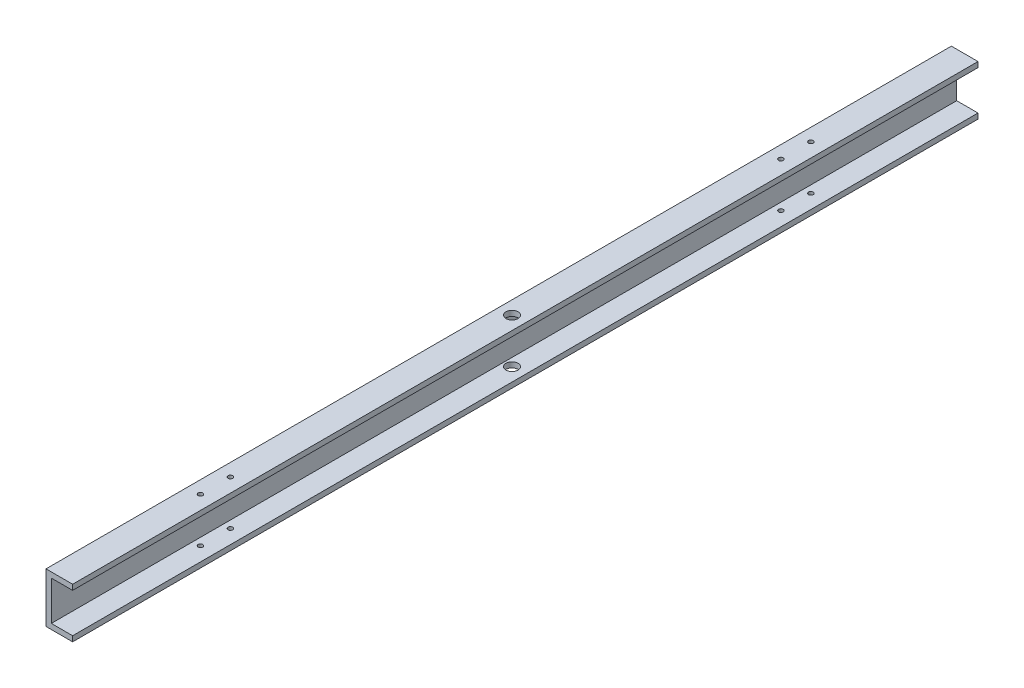
ISO-10303-21;
HEADER;
FILE_DESCRIPTION(('STEP AP214'),'2;1');
FILE_NAME('part.step','',(''),(''),'','','');
FILE_SCHEMA(('AUTOMOTIVE_DESIGN { 1 0 10303 214 1 1 1 1 }'));
ENDSEC;
DATA;
#1=APPLICATION_CONTEXT('core data for automotive mechanical design processes');
#2=APPLICATION_PROTOCOL_DEFINITION('international standard','automotive_design',2000,#1);
#3=PRODUCT_CONTEXT('',#1,'mechanical');
#4=PRODUCT('Part','Part','',(#3));
#5=PRODUCT_RELATED_PRODUCT_CATEGORY('part','',(#4));
#6=PRODUCT_DEFINITION_FORMATION('','',#4);
#7=PRODUCT_DEFINITION_CONTEXT('part definition',#1,'design');
#8=PRODUCT_DEFINITION('design','',#6,#7);
#9=PRODUCT_DEFINITION_SHAPE('','',#8);
#10=(LENGTH_UNIT() NAMED_UNIT(*) SI_UNIT(.MILLI.,.METRE.));
#11=(NAMED_UNIT(*) PLANE_ANGLE_UNIT() SI_UNIT($,.RADIAN.));
#12=(NAMED_UNIT(*) SI_UNIT($,.STERADIAN.) SOLID_ANGLE_UNIT());
#13=UNCERTAINTY_MEASURE_WITH_UNIT(LENGTH_MEASURE(1.E-05),#10,'distance_accuracy_value','');
#14=(GEOMETRIC_REPRESENTATION_CONTEXT(3) GLOBAL_UNCERTAINTY_ASSIGNED_CONTEXT((#13)) GLOBAL_UNIT_ASSIGNED_CONTEXT((#10,
#11,#12)) REPRESENTATION_CONTEXT('',''));
#15=CARTESIAN_POINT('',(0.,0.,0.));
#16=DIRECTION('',(0.,0.,1.));
#17=DIRECTION('',(1.,0.,0.));
#18=AXIS2_PLACEMENT_3D('',#15,#16,#17);
#19=CARTESIAN_POINT('',(-400.,550.,764.999999999999));
#20=DIRECTION('',(0.,1.,0.));
#21=DIRECTION('',(0.,0.,1.));
#22=AXIS2_PLACEMENT_3D('',#19,#20,#21);
#23=PLANE('',#22);
#24=CARTESIAN_POINT('',(-421.,550.,467.));
#25=DIRECTION('',(0.,1.,0.));
#26=DIRECTION('',(0.,0.,1.));
#27=AXIS2_PLACEMENT_3D('',#24,#25,#26);
#28=CIRCLE('',#27,3.50000000000002);
#29=CARTESIAN_POINT('',(-421.,550.,470.5));
#30=VERTEX_POINT('',#29);
#31=EDGE_CURVE('E242',#30,#30,#28,.T.);
#32=ORIENTED_EDGE('',*,*,#31,.T.);
#33=EDGE_LOOP('',(#32));
#34=FACE_BOUND('',#33,.T.);
#35=CARTESIAN_POINT('',(-421.,550.,422.));
#36=DIRECTION('',(0.,1.,0.));
#37=DIRECTION('',(0.,0.,1.));
#38=AXIS2_PLACEMENT_3D('',#35,#36,#37);
#39=CIRCLE('',#38,3.50000000000002);
#40=CARTESIAN_POINT('',(-421.,550.,425.5));
#41=VERTEX_POINT('',#40);
#42=EDGE_CURVE('E269',#41,#41,#39,.T.);
#43=ORIENTED_EDGE('',*,*,#42,.T.);
#44=EDGE_LOOP('',(#43));
#45=FACE_BOUND('',#44,.T.);
#46=CARTESIAN_POINT('',(-420.,550.,0.));
#47=DIRECTION('',(0.,1.,0.));
#48=DIRECTION('',(0.,0.,1.));
#49=AXIS2_PLACEMENT_3D('',#46,#47,#48);
#50=CIRCLE('',#49,8.99999999999998);
#51=CARTESIAN_POINT('',(-420.,550.,9.00000000000007));
#52=VERTEX_POINT('',#51);
#53=EDGE_CURVE('E262',#52,#52,#50,.T.);
#54=ORIENTED_EDGE('',*,*,#53,.T.);
#55=EDGE_LOOP('',(#54));
#56=FACE_BOUND('',#55,.T.);
#57=CARTESIAN_POINT('',(-421.,550.,-450.));
#58=DIRECTION('',(0.,1.,0.));
#59=DIRECTION('',(0.,0.,1.));
#60=AXIS2_PLACEMENT_3D('',#57,#58,#59);
#61=CIRCLE('',#60,3.50000000000002);
#62=CARTESIAN_POINT('',(-421.,550.,-446.5));
#63=VERTEX_POINT('',#62);
#64=EDGE_CURVE('E254',#63,#63,#61,.T.);
#65=ORIENTED_EDGE('',*,*,#64,.T.);
#66=EDGE_LOOP('',(#65));
#67=FACE_BOUND('',#66,.T.);
#68=CARTESIAN_POINT('',(-421.,550.,-405.));
#69=DIRECTION('',(0.,1.,0.));
#70=DIRECTION('',(0.,0.,1.));
#71=AXIS2_PLACEMENT_3D('',#68,#69,#70);
#72=CIRCLE('',#71,3.50000000000002);
#73=CARTESIAN_POINT('',(-421.,550.,-401.5));
#74=VERTEX_POINT('',#73);
#75=EDGE_CURVE('E247',#74,#74,#72,.T.);
#76=ORIENTED_EDGE('',*,*,#75,.T.);
#77=EDGE_LOOP('',(#76));
#78=FACE_BOUND('',#77,.T.);
#79=DIRECTION('',(1.,0.,0.));
#80=VECTOR('',#79,1.);
#81=CARTESIAN_POINT('',(-400.,550.,680.));
#82=LINE('',#81,#80);
#83=CARTESIAN_POINT('',(-440.,550.,680.));
#84=VERTEX_POINT('',#83);
#85=CARTESIAN_POINT('',(-400.,550.,680.));
#86=VERTEX_POINT('',#85);
#87=EDGE_CURVE('E148',#84,#86,#82,.T.);
#88=ORIENTED_EDGE('',*,*,#87,.F.);
#89=DIRECTION('',(0.,0.,-1.));
#90=VECTOR('',#89,1.);
#91=CARTESIAN_POINT('',(-440.,550.,764.999999999999));
#92=LINE('',#91,#90);
#93=CARTESIAN_POINT('',(-440.,550.,-680.));
#94=VERTEX_POINT('',#93);
#95=EDGE_CURVE('E44',#84,#94,#92,.T.);
#96=ORIENTED_EDGE('',*,*,#95,.T.);
#97=DIRECTION('',(1.,0.,0.));
#98=VECTOR('',#97,1.);
#99=CARTESIAN_POINT('',(-400.,550.,-680.));
#100=LINE('',#99,#98);
#101=CARTESIAN_POINT('',(-400.,550.,-680.));
#102=VERTEX_POINT('',#101);
#103=EDGE_CURVE('E159',#94,#102,#100,.T.);
#104=ORIENTED_EDGE('',*,*,#103,.T.);
#105=DIRECTION('',(0.,0.,-1.));
#106=VECTOR('',#105,1.);
#107=CARTESIAN_POINT('',(-400.,550.,764.999999999999));
#108=LINE('',#107,#106);
#109=EDGE_CURVE('E96',#86,#102,#108,.T.);
#110=ORIENTED_EDGE('',*,*,#109,.F.);
#111=EDGE_LOOP('',(#88,#96,#104,#110));
#112=FACE_BOUND('',#111,.T.);
#113=ADVANCED_FACE('F40',(#34,#45,#56,#67,#78,#112),#23,.F.);
#114=CARTESIAN_POINT('',(-400.,558.,764.999999999999));
#115=DIRECTION('',(-1.,0.,0.));
#116=DIRECTION('',(0.,-1.,0.));
#117=AXIS2_PLACEMENT_3D('',#114,#115,#116);
#118=PLANE('',#117);
#119=DIRECTION('',(0.,1.,0.));
#120=VECTOR('',#119,1.);
#121=CARTESIAN_POINT('',(-400.,558.,680.));
#122=LINE('',#121,#120);
#123=CARTESIAN_POINT('',(-400.,558.,680.));
#124=VERTEX_POINT('',#123);
#125=EDGE_CURVE('E103',#86,#124,#122,.T.);
#126=ORIENTED_EDGE('',*,*,#125,.F.);
#127=ORIENTED_EDGE('',*,*,#109,.T.);
#128=DIRECTION('',(0.,1.,0.));
#129=VECTOR('',#128,1.);
#130=CARTESIAN_POINT('',(-400.,558.,-680.));
#131=LINE('',#130,#129);
#132=CARTESIAN_POINT('',(-400.,558.,-680.));
#133=VERTEX_POINT('',#132);
#134=EDGE_CURVE('E158',#102,#133,#131,.T.);
#135=ORIENTED_EDGE('',*,*,#134,.T.);
#136=DIRECTION('',(0.,0.,-1.));
#137=VECTOR('',#136,1.);
#138=CARTESIAN_POINT('',(-400.,558.,764.999999999999));
#139=LINE('',#138,#137);
#140=EDGE_CURVE('E160',#124,#133,#139,.T.);
#141=ORIENTED_EDGE('',*,*,#140,.F.);
#142=EDGE_LOOP('',(#126,#127,#135,#141));
#143=FACE_BOUND('',#142,.T.);
#144=ADVANCED_FACE('F299',(#143),#118,.F.);
#145=CARTESIAN_POINT('',(-432.,558.,764.999999999999));
#146=DIRECTION('',(0.,-1.,0.));
#147=DIRECTION('',(1.,0.,0.));
#148=AXIS2_PLACEMENT_3D('',#145,#146,#147);
#149=PLANE('',#148);
#150=CARTESIAN_POINT('',(-421.,558.,467.));
#151=DIRECTION('',(0.,-1.,0.));
#152=DIRECTION('',(1.,0.,0.));
#153=AXIS2_PLACEMENT_3D('',#150,#151,#152);
#154=CIRCLE('',#153,3.50000000000002);
#155=CARTESIAN_POINT('',(-417.5,558.,467.));
#156=VERTEX_POINT('',#155);
#157=EDGE_CURVE('E200',#156,#156,#154,.T.);
#158=ORIENTED_EDGE('',*,*,#157,.T.);
#159=EDGE_LOOP('',(#158));
#160=FACE_BOUND('',#159,.T.);
#161=CARTESIAN_POINT('',(-421.,558.,422.));
#162=DIRECTION('',(0.,-1.,0.));
#163=DIRECTION('',(1.,0.,0.));
#164=AXIS2_PLACEMENT_3D('',#161,#162,#163);
#165=CIRCLE('',#164,3.50000000000002);
#166=CARTESIAN_POINT('',(-417.5,558.,422.));
#167=VERTEX_POINT('',#166);
#168=EDGE_CURVE('E208',#167,#167,#165,.T.);
#169=ORIENTED_EDGE('',*,*,#168,.T.);
#170=EDGE_LOOP('',(#169));
#171=FACE_BOUND('',#170,.T.);
#172=CARTESIAN_POINT('',(-420.,558.,0.));
#173=DIRECTION('',(0.,-1.,0.));
#174=DIRECTION('',(1.,0.,0.));
#175=AXIS2_PLACEMENT_3D('',#172,#173,#174);
#176=CIRCLE('',#175,8.99999999999998);
#177=CARTESIAN_POINT('',(-411.,558.,0.));
#178=VERTEX_POINT('',#177);
#179=EDGE_CURVE('E218',#178,#178,#176,.T.);
#180=ORIENTED_EDGE('',*,*,#179,.T.);
#181=EDGE_LOOP('',(#180));
#182=FACE_BOUND('',#181,.T.);
#183=CARTESIAN_POINT('',(-421.,558.,-450.));
#184=DIRECTION('',(0.,-1.,0.));
#185=DIRECTION('',(1.,0.,0.));
#186=AXIS2_PLACEMENT_3D('',#183,#184,#185);
#187=CIRCLE('',#186,3.50000000000002);
#188=CARTESIAN_POINT('',(-417.5,558.,-450.));
#189=VERTEX_POINT('',#188);
#190=EDGE_CURVE('E226',#189,#189,#187,.T.);
#191=ORIENTED_EDGE('',*,*,#190,.T.);
#192=EDGE_LOOP('',(#191));
#193=FACE_BOUND('',#192,.T.);
#194=CARTESIAN_POINT('',(-421.,558.,-405.));
#195=DIRECTION('',(0.,-1.,0.));
#196=DIRECTION('',(1.,0.,0.));
#197=AXIS2_PLACEMENT_3D('',#194,#195,#196);
#198=CIRCLE('',#197,3.50000000000002);
#199=CARTESIAN_POINT('',(-417.5,558.,-405.));
#200=VERTEX_POINT('',#199);
#201=EDGE_CURVE('E234',#200,#200,#198,.T.);
#202=ORIENTED_EDGE('',*,*,#201,.T.);
#203=EDGE_LOOP('',(#202));
#204=FACE_BOUND('',#203,.T.);
#205=DIRECTION('',(-1.,0.,0.));
#206=VECTOR('',#205,1.);
#207=CARTESIAN_POINT('',(-432.,558.,680.));
#208=LINE('',#207,#206);
#209=CARTESIAN_POINT('',(-432.,558.,680.));
#210=VERTEX_POINT('',#209);
#211=EDGE_CURVE('E142',#124,#210,#208,.T.);
#212=ORIENTED_EDGE('',*,*,#211,.F.);
#213=ORIENTED_EDGE('',*,*,#140,.T.);
#214=DIRECTION('',(-1.,0.,0.));
#215=VECTOR('',#214,1.);
#216=CARTESIAN_POINT('',(-432.,558.,-680.));
#217=LINE('',#216,#215);
#218=CARTESIAN_POINT('',(-432.,558.,-680.));
#219=VERTEX_POINT('',#218);
#220=EDGE_CURVE('E163',#133,#219,#217,.T.);
#221=ORIENTED_EDGE('',*,*,#220,.T.);
#222=DIRECTION('',(0.,0.,-1.));
#223=VECTOR('',#222,1.);
#224=CARTESIAN_POINT('',(-432.,558.,764.999999999999));
#225=LINE('',#224,#223);
#226=EDGE_CURVE('E164',#210,#219,#225,.T.);
#227=ORIENTED_EDGE('',*,*,#226,.F.);
#228=EDGE_LOOP('',(#212,#213,#221,#227));
#229=FACE_BOUND('',#228,.T.);
#230=ADVANCED_FACE('F303',(#160,#171,#182,#193,#204,#229),#149,.F.);
#231=CARTESIAN_POINT('',(-432.,617.,764.999999999999));
#232=DIRECTION('',(-1.,0.,0.));
#233=DIRECTION('',(0.,0.,1.));
#234=AXIS2_PLACEMENT_3D('',#231,#232,#233);
#235=PLANE('',#234);
#236=DIRECTION('',(0.,1.,0.));
#237=VECTOR('',#236,1.);
#238=CARTESIAN_POINT('',(-432.,617.,680.));
#239=LINE('',#238,#237);
#240=CARTESIAN_POINT('',(-432.,617.,680.));
#241=VERTEX_POINT('',#240);
#242=EDGE_CURVE('E136',#210,#241,#239,.T.);
#243=ORIENTED_EDGE('',*,*,#242,.F.);
#244=ORIENTED_EDGE('',*,*,#226,.T.);
#245=DIRECTION('',(0.,1.,0.));
#246=VECTOR('',#245,1.);
#247=CARTESIAN_POINT('',(-432.,617.,-680.));
#248=LINE('',#247,#246);
#249=CARTESIAN_POINT('',(-432.,617.,-680.));
#250=VERTEX_POINT('',#249);
#251=EDGE_CURVE('E167',#219,#250,#248,.T.);
#252=ORIENTED_EDGE('',*,*,#251,.T.);
#253=DIRECTION('',(0.,0.,-1.));
#254=VECTOR('',#253,1.);
#255=CARTESIAN_POINT('',(-432.,617.,764.999999999999));
#256=LINE('',#255,#254);
#257=EDGE_CURVE('E168',#241,#250,#256,.T.);
#258=ORIENTED_EDGE('',*,*,#257,.F.);
#259=EDGE_LOOP('',(#243,#244,#252,#258));
#260=FACE_BOUND('',#259,.T.);
#261=ADVANCED_FACE('F308',(#260),#235,.F.);
#262=CARTESIAN_POINT('',(-400.,617.,764.999999999999));
#263=DIRECTION('',(0.,1.,0.));
#264=DIRECTION('',(0.,0.,1.));
#265=AXIS2_PLACEMENT_3D('',#262,#263,#264);
#266=PLANE('',#265);
#267=CARTESIAN_POINT('',(-421.,617.,467.));
#268=DIRECTION('',(0.,1.,0.));
#269=DIRECTION('',(0.,0.,1.));
#270=AXIS2_PLACEMENT_3D('',#267,#268,#269);
#271=CIRCLE('',#270,3.50000000000002);
#272=CARTESIAN_POINT('',(-421.,617.,470.5));
#273=VERTEX_POINT('',#272);
#274=EDGE_CURVE('E204',#273,#273,#271,.T.);
#275=ORIENTED_EDGE('',*,*,#274,.T.);
#276=EDGE_LOOP('',(#275));
#277=FACE_BOUND('',#276,.T.);
#278=CARTESIAN_POINT('',(-421.,617.,422.));
#279=DIRECTION('',(0.,1.,0.));
#280=DIRECTION('',(0.,0.,1.));
#281=AXIS2_PLACEMENT_3D('',#278,#279,#280);
#282=CIRCLE('',#281,3.50000000000002);
#283=CARTESIAN_POINT('',(-421.,617.,425.5));
#284=VERTEX_POINT('',#283);
#285=EDGE_CURVE('E214',#284,#284,#282,.T.);
#286=ORIENTED_EDGE('',*,*,#285,.T.);
#287=EDGE_LOOP('',(#286));
#288=FACE_BOUND('',#287,.T.);
#289=CARTESIAN_POINT('',(-420.,617.,0.));
#290=DIRECTION('',(0.,1.,0.));
#291=DIRECTION('',(0.,0.,1.));
#292=AXIS2_PLACEMENT_3D('',#289,#290,#291);
#293=CIRCLE('',#292,8.99999999999998);
#294=CARTESIAN_POINT('',(-420.,617.,9.00000000000007));
#295=VERTEX_POINT('',#294);
#296=EDGE_CURVE('E222',#295,#295,#293,.T.);
#297=ORIENTED_EDGE('',*,*,#296,.T.);
#298=EDGE_LOOP('',(#297));
#299=FACE_BOUND('',#298,.T.);
#300=CARTESIAN_POINT('',(-421.,617.,-450.));
#301=DIRECTION('',(0.,1.,0.));
#302=DIRECTION('',(0.,0.,1.));
#303=AXIS2_PLACEMENT_3D('',#300,#301,#302);
#304=CIRCLE('',#303,3.50000000000002);
#305=CARTESIAN_POINT('',(-421.,617.,-446.5));
#306=VERTEX_POINT('',#305);
#307=EDGE_CURVE('E230',#306,#306,#304,.T.);
#308=ORIENTED_EDGE('',*,*,#307,.T.);
#309=EDGE_LOOP('',(#308));
#310=FACE_BOUND('',#309,.T.);
#311=CARTESIAN_POINT('',(-421.,617.,-405.));
#312=DIRECTION('',(0.,1.,0.));
#313=DIRECTION('',(0.,0.,1.));
#314=AXIS2_PLACEMENT_3D('',#311,#312,#313);
#315=CIRCLE('',#314,3.50000000000002);
#316=CARTESIAN_POINT('',(-421.,617.,-401.5));
#317=VERTEX_POINT('',#316);
#318=EDGE_CURVE('E238',#317,#317,#315,.T.);
#319=ORIENTED_EDGE('',*,*,#318,.T.);
#320=EDGE_LOOP('',(#319));
#321=FACE_BOUND('',#320,.T.);
#322=DIRECTION('',(1.,0.,0.));
#323=VECTOR('',#322,1.);
#324=CARTESIAN_POINT('',(-400.,617.,680.));
#325=LINE('',#324,#323);
#326=CARTESIAN_POINT('',(-400.,617.,680.));
#327=VERTEX_POINT('',#326);
#328=EDGE_CURVE('E130',#241,#327,#325,.T.);
#329=ORIENTED_EDGE('',*,*,#328,.F.);
#330=ORIENTED_EDGE('',*,*,#257,.T.);
#331=DIRECTION('',(1.,0.,0.));
#332=VECTOR('',#331,1.);
#333=CARTESIAN_POINT('',(-400.,617.,-680.));
#334=LINE('',#333,#332);
#335=CARTESIAN_POINT('',(-400.,617.,-680.));
#336=VERTEX_POINT('',#335);
#337=EDGE_CURVE('E171',#250,#336,#334,.T.);
#338=ORIENTED_EDGE('',*,*,#337,.T.);
#339=DIRECTION('',(0.,0.,-1.));
#340=VECTOR('',#339,1.);
#341=CARTESIAN_POINT('',(-400.,617.,764.999999999999));
#342=LINE('',#341,#340);
#343=EDGE_CURVE('E172',#327,#336,#342,.T.);
#344=ORIENTED_EDGE('',*,*,#343,.F.);
#345=EDGE_LOOP('',(#329,#330,#338,#344));
#346=FACE_BOUND('',#345,.T.);
#347=ADVANCED_FACE('F311',(#277,#288,#299,#310,#321,#346),#266,.F.);
#348=CARTESIAN_POINT('',(-400.,625.,764.999999999999));
#349=DIRECTION('',(-1.,0.,0.));
#350=DIRECTION('',(0.,0.,1.));
#351=AXIS2_PLACEMENT_3D('',#348,#349,#350);
#352=PLANE('',#351);
#353=DIRECTION('',(0.,1.,0.));
#354=VECTOR('',#353,1.);
#355=CARTESIAN_POINT('',(-400.,625.,680.));
#356=LINE('',#355,#354);
#357=CARTESIAN_POINT('',(-400.,625.,680.));
#358=VERTEX_POINT('',#357);
#359=EDGE_CURVE('E50',#327,#358,#356,.T.);
#360=ORIENTED_EDGE('',*,*,#359,.F.);
#361=ORIENTED_EDGE('',*,*,#343,.T.);
#362=DIRECTION('',(0.,1.,0.));
#363=VECTOR('',#362,1.);
#364=CARTESIAN_POINT('',(-400.,625.,-680.));
#365=LINE('',#364,#363);
#366=CARTESIAN_POINT('',(-400.,625.,-680.));
#367=VERTEX_POINT('',#366);
#368=EDGE_CURVE('E123',#336,#367,#365,.T.);
#369=ORIENTED_EDGE('',*,*,#368,.T.);
#370=DIRECTION('',(0.,0.,-1.));
#371=VECTOR('',#370,1.);
#372=CARTESIAN_POINT('',(-400.,625.,764.999999999999));
#373=LINE('',#372,#371);
#374=EDGE_CURVE('E114',#358,#367,#373,.T.);
#375=ORIENTED_EDGE('',*,*,#374,.F.);
#376=EDGE_LOOP('',(#360,#361,#369,#375));
#377=FACE_BOUND('',#376,.T.);
#378=ADVANCED_FACE('F120',(#377),#352,.F.);
#379=CARTESIAN_POINT('',(-440.,625.,764.999999999999));
#380=DIRECTION('',(0.,-1.,0.));
#381=DIRECTION('',(0.,0.,-1.));
#382=AXIS2_PLACEMENT_3D('',#379,#380,#381);
#383=PLANE('',#382);
#384=CARTESIAN_POINT('',(-421.,625.,467.));
#385=DIRECTION('',(0.,1.,0.));
#386=DIRECTION('',(0.,0.,1.));
#387=AXIS2_PLACEMENT_3D('',#384,#385,#386);
#388=CIRCLE('',#387,3.50000000000002);
#389=CARTESIAN_POINT('',(-421.,625.,470.5));
#390=VERTEX_POINT('',#389);
#391=EDGE_CURVE('E272',#390,#390,#388,.T.);
#392=ORIENTED_EDGE('',*,*,#391,.F.);
#393=EDGE_LOOP('',(#392));
#394=FACE_BOUND('',#393,.T.);
#395=CARTESIAN_POINT('',(-421.,625.,422.));
#396=DIRECTION('',(0.,1.,0.));
#397=DIRECTION('',(0.,0.,1.));
#398=AXIS2_PLACEMENT_3D('',#395,#396,#397);
#399=CIRCLE('',#398,3.50000000000002);
#400=CARTESIAN_POINT('',(-421.,625.,425.5));
#401=VERTEX_POINT('',#400);
#402=EDGE_CURVE('E265',#401,#401,#399,.T.);
#403=ORIENTED_EDGE('',*,*,#402,.F.);
#404=EDGE_LOOP('',(#403));
#405=FACE_BOUND('',#404,.T.);
#406=CARTESIAN_POINT('',(-420.,625.,0.));
#407=DIRECTION('',(0.,1.,0.));
#408=DIRECTION('',(0.,0.,1.));
#409=AXIS2_PLACEMENT_3D('',#406,#407,#408);
#410=CIRCLE('',#409,8.99999999999998);
#411=CARTESIAN_POINT('',(-420.,625.,9.00000000000007));
#412=VERTEX_POINT('',#411);
#413=EDGE_CURVE('E258',#412,#412,#410,.T.);
#414=ORIENTED_EDGE('',*,*,#413,.F.);
#415=EDGE_LOOP('',(#414));
#416=FACE_BOUND('',#415,.T.);
#417=CARTESIAN_POINT('',(-421.,625.,-450.));
#418=DIRECTION('',(0.,1.,0.));
#419=DIRECTION('',(0.,0.,1.));
#420=AXIS2_PLACEMENT_3D('',#417,#418,#419);
#421=CIRCLE('',#420,3.50000000000002);
#422=CARTESIAN_POINT('',(-421.,625.,-446.5));
#423=VERTEX_POINT('',#422);
#424=EDGE_CURVE('E251',#423,#423,#421,.T.);
#425=ORIENTED_EDGE('',*,*,#424,.F.);
#426=EDGE_LOOP('',(#425));
#427=FACE_BOUND('',#426,.T.);
#428=CARTESIAN_POINT('',(-421.,625.,-405.));
#429=DIRECTION('',(0.,1.,0.));
#430=DIRECTION('',(0.,0.,1.));
#431=AXIS2_PLACEMENT_3D('',#428,#429,#430);
#432=CIRCLE('',#431,3.50000000000002);
#433=CARTESIAN_POINT('',(-421.,625.,-401.5));
#434=VERTEX_POINT('',#433);
#435=EDGE_CURVE('E243',#434,#434,#432,.T.);
#436=ORIENTED_EDGE('',*,*,#435,.F.);
#437=EDGE_LOOP('',(#436));
#438=FACE_BOUND('',#437,.T.);
#439=DIRECTION('',(-1.,0.,0.));
#440=VECTOR('',#439,1.);
#441=CARTESIAN_POINT('',(-440.,625.,680.));
#442=LINE('',#441,#440);
#443=CARTESIAN_POINT('',(-440.,625.,680.));
#444=VERTEX_POINT('',#443);
#445=EDGE_CURVE('E11',#358,#444,#442,.T.);
#446=ORIENTED_EDGE('',*,*,#445,.F.);
#447=ORIENTED_EDGE('',*,*,#374,.T.);
#448=DIRECTION('',(-1.,0.,0.));
#449=VECTOR('',#448,1.);
#450=CARTESIAN_POINT('',(-440.,625.,-680.));
#451=LINE('',#450,#449);
#452=CARTESIAN_POINT('',(-440.,625.,-680.));
#453=VERTEX_POINT('',#452);
#454=EDGE_CURVE('E126',#367,#453,#451,.T.);
#455=ORIENTED_EDGE('',*,*,#454,.T.);
#456=DIRECTION('',(0.,0.,-1.));
#457=VECTOR('',#456,1.);
#458=CARTESIAN_POINT('',(-440.,625.,764.999999999999));
#459=LINE('',#458,#457);
#460=EDGE_CURVE('E63',#444,#453,#459,.T.);
#461=ORIENTED_EDGE('',*,*,#460,.F.);
#462=EDGE_LOOP('',(#446,#447,#455,#461));
#463=FACE_BOUND('',#462,.T.);
#464=ADVANCED_FACE('F113',(#394,#405,#416,#427,#438,#463),#383,.F.);
#465=CARTESIAN_POINT('',(-440.,550.,764.999999999999));
#466=DIRECTION('',(1.,0.,0.));
#467=DIRECTION('',(0.,0.,-1.));
#468=AXIS2_PLACEMENT_3D('',#465,#466,#467);
#469=PLANE('',#468);
#470=DIRECTION('',(0.,-1.,0.));
#471=VECTOR('',#470,1.);
#472=CARTESIAN_POINT('',(-440.,550.,680.));
#473=LINE('',#472,#471);
#474=EDGE_CURVE('E152',#444,#84,#473,.T.);
#475=ORIENTED_EDGE('',*,*,#474,.F.);
#476=ORIENTED_EDGE('',*,*,#460,.T.);
#477=DIRECTION('',(0.,-1.,0.));
#478=VECTOR('',#477,1.);
#479=CARTESIAN_POINT('',(-440.,550.,-680.));
#480=LINE('',#479,#478);
#481=EDGE_CURVE('E155',#453,#94,#480,.T.);
#482=ORIENTED_EDGE('',*,*,#481,.T.);
#483=ORIENTED_EDGE('',*,*,#95,.F.);
#484=EDGE_LOOP('',(#475,#476,#482,#483));
#485=FACE_BOUND('',#484,.T.);
#486=ADVANCED_FACE('F320',(#485),#469,.F.);
#487=CARTESIAN_POINT('',(0.,0.,-680.));
#488=DIRECTION('',(0.,0.,-1.));
#489=DIRECTION('',(-1.,0.,0.));
#490=AXIS2_PLACEMENT_3D('',#487,#488,#489);
#491=PLANE('',#490);
#492=ORIENTED_EDGE('',*,*,#103,.F.);
#493=ORIENTED_EDGE('',*,*,#481,.F.);
#494=ORIENTED_EDGE('',*,*,#454,.F.);
#495=ORIENTED_EDGE('',*,*,#368,.F.);
#496=ORIENTED_EDGE('',*,*,#337,.F.);
#497=ORIENTED_EDGE('',*,*,#251,.F.);
#498=ORIENTED_EDGE('',*,*,#220,.F.);
#499=ORIENTED_EDGE('',*,*,#134,.F.);
#500=EDGE_LOOP('',(#492,#493,#494,#495,#496,#497,#498,#499));
#501=FACE_BOUND('',#500,.T.);
#502=ADVANCED_FACE('F324',(#501),#491,.T.);
#503=CARTESIAN_POINT('',(400.,950.,680.));
#504=DIRECTION('',(0.,0.,1.));
#505=DIRECTION('',(1.,0.,0.));
#506=AXIS2_PLACEMENT_3D('',#503,#504,#505);
#507=PLANE('',#506);
#508=ORIENTED_EDGE('',*,*,#474,.T.);
#509=ORIENTED_EDGE('',*,*,#87,.T.);
#510=ORIENTED_EDGE('',*,*,#125,.T.);
#511=ORIENTED_EDGE('',*,*,#211,.T.);
#512=ORIENTED_EDGE('',*,*,#242,.T.);
#513=ORIENTED_EDGE('',*,*,#328,.T.);
#514=ORIENTED_EDGE('',*,*,#359,.T.);
#515=ORIENTED_EDGE('',*,*,#445,.T.);
#516=EDGE_LOOP('',(#508,#509,#510,#511,#512,#513,#514,#515));
#517=FACE_BOUND('',#516,.T.);
#518=ADVANCED_FACE('F42',(#517),#507,.T.);
#519=CARTESIAN_POINT('',(-421.,550.,-405.));
#520=DIRECTION('',(0.,1.,0.));
#521=DIRECTION('',(0.,0.,1.));
#522=AXIS2_PLACEMENT_3D('',#519,#520,#521);
#523=CYLINDRICAL_SURFACE('',#522,3.50000000000002);
#524=ORIENTED_EDGE('',*,*,#435,.T.);
#525=EDGE_LOOP('',(#524));
#526=FACE_BOUND('',#525,.T.);
#527=ORIENTED_EDGE('',*,*,#318,.F.);
#528=EDGE_LOOP('',(#527));
#529=FACE_BOUND('',#528,.T.);
#530=ADVANCED_FACE('F332',(#526,#529),#523,.F.);
#531=CARTESIAN_POINT('',(-421.,550.,-450.));
#532=DIRECTION('',(0.,1.,0.));
#533=DIRECTION('',(0.,0.,1.));
#534=AXIS2_PLACEMENT_3D('',#531,#532,#533);
#535=CYLINDRICAL_SURFACE('',#534,3.50000000000002);
#536=ORIENTED_EDGE('',*,*,#424,.T.);
#537=EDGE_LOOP('',(#536));
#538=FACE_BOUND('',#537,.T.);
#539=ORIENTED_EDGE('',*,*,#307,.F.);
#540=EDGE_LOOP('',(#539));
#541=FACE_BOUND('',#540,.T.);
#542=ADVANCED_FACE('F336',(#538,#541),#535,.F.);
#543=CARTESIAN_POINT('',(-420.,550.,0.));
#544=DIRECTION('',(0.,1.,0.));
#545=DIRECTION('',(0.,0.,1.));
#546=AXIS2_PLACEMENT_3D('',#543,#544,#545);
#547=CYLINDRICAL_SURFACE('',#546,8.99999999999998);
#548=ORIENTED_EDGE('',*,*,#413,.T.);
#549=EDGE_LOOP('',(#548));
#550=FACE_BOUND('',#549,.T.);
#551=ORIENTED_EDGE('',*,*,#296,.F.);
#552=EDGE_LOOP('',(#551));
#553=FACE_BOUND('',#552,.T.);
#554=ADVANCED_FACE('F339',(#550,#553),#547,.F.);
#555=CARTESIAN_POINT('',(-421.,550.,422.));
#556=DIRECTION('',(0.,1.,0.));
#557=DIRECTION('',(0.,0.,1.));
#558=AXIS2_PLACEMENT_3D('',#555,#556,#557);
#559=CYLINDRICAL_SURFACE('',#558,3.50000000000002);
#560=ORIENTED_EDGE('',*,*,#402,.T.);
#561=EDGE_LOOP('',(#560));
#562=FACE_BOUND('',#561,.T.);
#563=ORIENTED_EDGE('',*,*,#285,.F.);
#564=EDGE_LOOP('',(#563));
#565=FACE_BOUND('',#564,.T.);
#566=ADVANCED_FACE('F294',(#562,#565),#559,.F.);
#567=CARTESIAN_POINT('',(-421.,550.,467.));
#568=DIRECTION('',(0.,1.,0.));
#569=DIRECTION('',(0.,0.,1.));
#570=AXIS2_PLACEMENT_3D('',#567,#568,#569);
#571=CYLINDRICAL_SURFACE('',#570,3.50000000000002);
#572=ORIENTED_EDGE('',*,*,#391,.T.);
#573=EDGE_LOOP('',(#572));
#574=FACE_BOUND('',#573,.T.);
#575=ORIENTED_EDGE('',*,*,#274,.F.);
#576=EDGE_LOOP('',(#575));
#577=FACE_BOUND('',#576,.T.);
#578=ADVANCED_FACE('F287',(#574,#577),#571,.F.);
#579=ORIENTED_EDGE('',*,*,#75,.F.);
#580=EDGE_LOOP('',(#579));
#581=FACE_BOUND('',#580,.T.);
#582=ORIENTED_EDGE('',*,*,#201,.F.);
#583=EDGE_LOOP('',(#582));
#584=FACE_BOUND('',#583,.T.);
#585=ADVANCED_FACE('F296',(#581,#584),#523,.F.);
#586=ORIENTED_EDGE('',*,*,#64,.F.);
#587=EDGE_LOOP('',(#586));
#588=FACE_BOUND('',#587,.T.);
#589=ORIENTED_EDGE('',*,*,#190,.F.);
#590=EDGE_LOOP('',(#589));
#591=FACE_BOUND('',#590,.T.);
#592=ADVANCED_FACE('F330',(#588,#591),#535,.F.);
#593=ORIENTED_EDGE('',*,*,#53,.F.);
#594=EDGE_LOOP('',(#593));
#595=FACE_BOUND('',#594,.T.);
#596=ORIENTED_EDGE('',*,*,#179,.F.);
#597=EDGE_LOOP('',(#596));
#598=FACE_BOUND('',#597,.T.);
#599=ADVANCED_FACE('F291',(#595,#598),#547,.F.);
#600=ORIENTED_EDGE('',*,*,#42,.F.);
#601=EDGE_LOOP('',(#600));
#602=FACE_BOUND('',#601,.T.);
#603=ORIENTED_EDGE('',*,*,#168,.F.);
#604=EDGE_LOOP('',(#603));
#605=FACE_BOUND('',#604,.T.);
#606=ADVANCED_FACE('F285',(#602,#605),#559,.F.);
#607=ORIENTED_EDGE('',*,*,#31,.F.);
#608=EDGE_LOOP('',(#607));
#609=FACE_BOUND('',#608,.T.);
#610=ORIENTED_EDGE('',*,*,#157,.F.);
#611=EDGE_LOOP('',(#610));
#612=FACE_BOUND('',#611,.T.);
#613=ADVANCED_FACE('F282',(#609,#612),#571,.F.);
#614=CLOSED_SHELL('',(#113,#144,#230,#261,#347,#378,#464,#486,#502,#518,#530,#542,#554,#566,
#578,#585,#592,#599,#606,#613));
#615=MANIFOLD_SOLID_BREP('B2',#614);
#616=ADVANCED_BREP_SHAPE_REPRESENTATION('',(#18,#615),#14);
#617=SHAPE_DEFINITION_REPRESENTATION(#9,#616);
ENDSEC;
END-ISO-10303-21;
